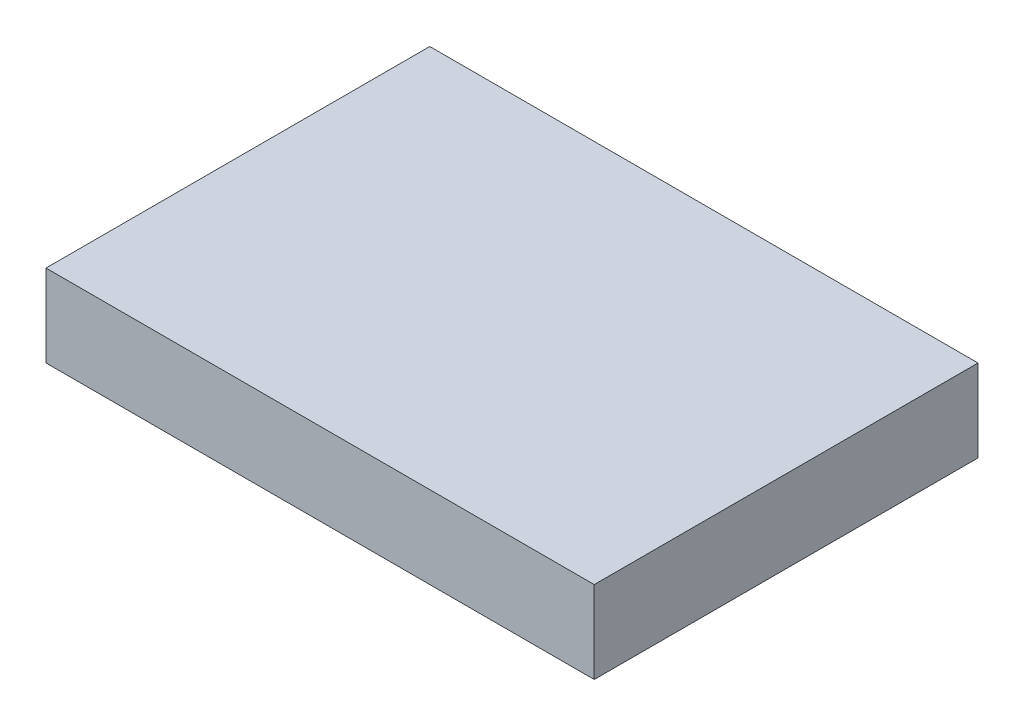
ISO-10303-21;
HEADER;
FILE_DESCRIPTION(('STEP AP214'),'2;1');
FILE_NAME('part.step','',(''),(''),'','','');
FILE_SCHEMA(('AUTOMOTIVE_DESIGN { 1 0 10303 214 1 1 1 1 }'));
ENDSEC;
DATA;
#1=APPLICATION_CONTEXT('core data for automotive mechanical design processes');
#2=APPLICATION_PROTOCOL_DEFINITION('international standard','automotive_design',2000,#1);
#3=PRODUCT_CONTEXT('',#1,'mechanical');
#4=PRODUCT('Part','Part','',(#3));
#5=PRODUCT_RELATED_PRODUCT_CATEGORY('part','',(#4));
#6=PRODUCT_DEFINITION_FORMATION('','',#4);
#7=PRODUCT_DEFINITION_CONTEXT('part definition',#1,'design');
#8=PRODUCT_DEFINITION('design','',#6,#7);
#9=PRODUCT_DEFINITION_SHAPE('','',#8);
#10=(LENGTH_UNIT() NAMED_UNIT(*) SI_UNIT(.MILLI.,.METRE.));
#11=(NAMED_UNIT(*) PLANE_ANGLE_UNIT() SI_UNIT($,.RADIAN.));
#12=(NAMED_UNIT(*) SI_UNIT($,.STERADIAN.) SOLID_ANGLE_UNIT());
#13=UNCERTAINTY_MEASURE_WITH_UNIT(LENGTH_MEASURE(1.E-05),#10,'distance_accuracy_value','');
#14=(GEOMETRIC_REPRESENTATION_CONTEXT(3) GLOBAL_UNCERTAINTY_ASSIGNED_CONTEXT((#13)) GLOBAL_UNIT_ASSIGNED_CONTEXT((#10,
#11,#12)) REPRESENTATION_CONTEXT('',''));
#15=CARTESIAN_POINT('',(0.,0.,0.));
#16=DIRECTION('',(0.,0.,1.));
#17=DIRECTION('',(1.,0.,0.));
#18=AXIS2_PLACEMENT_3D('',#15,#16,#17);
#19=CARTESIAN_POINT('',(50.,15.,35.));
#20=DIRECTION('',(-1.,0.,0.));
#21=DIRECTION('',(0.,0.,1.));
#22=AXIS2_PLACEMENT_3D('',#19,#20,#21);
#23=PLANE('',#22);
#24=DIRECTION('',(0.,0.,-1.));
#25=VECTOR('',#24,1.);
#26=CARTESIAN_POINT('',(50.,0.,35.));
#27=LINE('',#26,#25);
#28=CARTESIAN_POINT('',(50.,0.,35.));
#29=VERTEX_POINT('',#28);
#30=CARTESIAN_POINT('',(50.,0.,-35.));
#31=VERTEX_POINT('',#30);
#32=EDGE_CURVE('E94',#29,#31,#27,.T.);
#33=ORIENTED_EDGE('',*,*,#32,.T.);
#34=DIRECTION('',(0.,-1.,0.));
#35=VECTOR('',#34,1.);
#36=CARTESIAN_POINT('',(50.,15.,-35.));
#37=LINE('',#36,#35);
#38=CARTESIAN_POINT('',(50.,15.,-35.));
#39=VERTEX_POINT('',#38);
#40=EDGE_CURVE('E11',#39,#31,#37,.T.);
#41=ORIENTED_EDGE('',*,*,#40,.F.);
#42=DIRECTION('',(0.,0.,-1.));
#43=VECTOR('',#42,1.);
#44=CARTESIAN_POINT('',(50.,15.,35.));
#45=LINE('',#44,#43);
#46=CARTESIAN_POINT('',(50.,15.,35.));
#47=VERTEX_POINT('',#46);
#48=EDGE_CURVE('E82',#47,#39,#45,.T.);
#49=ORIENTED_EDGE('',*,*,#48,.F.);
#50=DIRECTION('',(0.,-1.,0.));
#51=VECTOR('',#50,1.);
#52=CARTESIAN_POINT('',(50.,15.,35.));
#53=LINE('',#52,#51);
#54=EDGE_CURVE('E90',#47,#29,#53,.T.);
#55=ORIENTED_EDGE('',*,*,#54,.T.);
#56=EDGE_LOOP('',(#33,#41,#49,#55));
#57=FACE_BOUND('',#56,.T.);
#58=ADVANCED_FACE('F31',(#57),#23,.F.);
#59=CARTESIAN_POINT('',(-50.,15.,-35.));
#60=DIRECTION('',(0.,0.,1.));
#61=DIRECTION('',(1.,0.,0.));
#62=AXIS2_PLACEMENT_3D('',#59,#60,#61);
#63=PLANE('',#62);
#64=DIRECTION('',(-1.,0.,0.));
#65=VECTOR('',#64,1.);
#66=CARTESIAN_POINT('',(-50.,0.,-35.));
#67=LINE('',#66,#65);
#68=CARTESIAN_POINT('',(-50.,0.,-35.));
#69=VERTEX_POINT('',#68);
#70=EDGE_CURVE('E86',#31,#69,#67,.T.);
#71=ORIENTED_EDGE('',*,*,#70,.T.);
#72=DIRECTION('',(0.,-1.,0.));
#73=VECTOR('',#72,1.);
#74=CARTESIAN_POINT('',(-50.,15.,-35.));
#75=LINE('',#74,#73);
#76=CARTESIAN_POINT('',(-50.,15.,-35.));
#77=VERTEX_POINT('',#76);
#78=EDGE_CURVE('E39',#77,#69,#75,.T.);
#79=ORIENTED_EDGE('',*,*,#78,.F.);
#80=DIRECTION('',(-1.,0.,0.));
#81=VECTOR('',#80,1.);
#82=CARTESIAN_POINT('',(-50.,15.,-35.));
#83=LINE('',#82,#81);
#84=EDGE_CURVE('E77',#39,#77,#83,.T.);
#85=ORIENTED_EDGE('',*,*,#84,.F.);
#86=ORIENTED_EDGE('',*,*,#40,.T.);
#87=EDGE_LOOP('',(#71,#79,#85,#86));
#88=FACE_BOUND('',#87,.T.);
#89=ADVANCED_FACE('F85',(#88),#63,.F.);
#90=CARTESIAN_POINT('',(-50.,15.,35.));
#91=DIRECTION('',(1.,0.,0.));
#92=DIRECTION('',(0.,0.,-1.));
#93=AXIS2_PLACEMENT_3D('',#90,#91,#92);
#94=PLANE('',#93);
#95=DIRECTION('',(0.,0.,1.));
#96=VECTOR('',#95,1.);
#97=CARTESIAN_POINT('',(-50.,0.,35.));
#98=LINE('',#97,#96);
#99=CARTESIAN_POINT('',(-50.,0.,35.));
#100=VERTEX_POINT('',#99);
#101=EDGE_CURVE('E64',#69,#100,#98,.T.);
#102=ORIENTED_EDGE('',*,*,#101,.T.);
#103=DIRECTION('',(0.,-1.,0.));
#104=VECTOR('',#103,1.);
#105=CARTESIAN_POINT('',(-50.,15.,35.));
#106=LINE('',#105,#104);
#107=CARTESIAN_POINT('',(-50.,15.,35.));
#108=VERTEX_POINT('',#107);
#109=EDGE_CURVE('E87',#108,#100,#106,.T.);
#110=ORIENTED_EDGE('',*,*,#109,.F.);
#111=DIRECTION('',(0.,0.,1.));
#112=VECTOR('',#111,1.);
#113=CARTESIAN_POINT('',(-50.,15.,35.));
#114=LINE('',#113,#112);
#115=EDGE_CURVE('E80',#77,#108,#114,.T.);
#116=ORIENTED_EDGE('',*,*,#115,.F.);
#117=ORIENTED_EDGE('',*,*,#78,.T.);
#118=EDGE_LOOP('',(#102,#110,#116,#117));
#119=FACE_BOUND('',#118,.T.);
#120=ADVANCED_FACE('F88',(#119),#94,.F.);
#121=CARTESIAN_POINT('',(-50.,15.,35.));
#122=DIRECTION('',(0.,0.,-1.));
#123=DIRECTION('',(-1.,0.,0.));
#124=AXIS2_PLACEMENT_3D('',#121,#122,#123);
#125=PLANE('',#124);
#126=DIRECTION('',(1.,0.,0.));
#127=VECTOR('',#126,1.);
#128=CARTESIAN_POINT('',(-50.,0.,35.));
#129=LINE('',#128,#127);
#130=EDGE_CURVE('E70',#100,#29,#129,.T.);
#131=ORIENTED_EDGE('',*,*,#130,.T.);
#132=ORIENTED_EDGE('',*,*,#54,.F.);
#133=DIRECTION('',(1.,0.,0.));
#134=VECTOR('',#133,1.);
#135=CARTESIAN_POINT('',(-50.,15.,35.));
#136=LINE('',#135,#134);
#137=EDGE_CURVE('E47',#108,#47,#136,.T.);
#138=ORIENTED_EDGE('',*,*,#137,.F.);
#139=ORIENTED_EDGE('',*,*,#109,.T.);
#140=EDGE_LOOP('',(#131,#132,#138,#139));
#141=FACE_BOUND('',#140,.T.);
#142=ADVANCED_FACE('F101',(#141),#125,.F.);
#143=CARTESIAN_POINT('',(50.,15.,-35.));
#144=DIRECTION('',(0.,-1.,0.));
#145=DIRECTION('',(0.,0.,-1.));
#146=AXIS2_PLACEMENT_3D('',#143,#144,#145);
#147=PLANE('',#146);
#148=ORIENTED_EDGE('',*,*,#48,.T.);
#149=ORIENTED_EDGE('',*,*,#84,.T.);
#150=ORIENTED_EDGE('',*,*,#115,.T.);
#151=ORIENTED_EDGE('',*,*,#137,.T.);
#152=EDGE_LOOP('',(#148,#149,#150,#151));
#153=FACE_BOUND('',#152,.T.);
#154=ADVANCED_FACE('F78',(#153),#147,.F.);
#155=CARTESIAN_POINT('',(50.,0.,-35.));
#156=DIRECTION('',(0.,-1.,0.));
#157=DIRECTION('',(0.,0.,-1.));
#158=AXIS2_PLACEMENT_3D('',#155,#156,#157);
#159=PLANE('',#158);
#160=ORIENTED_EDGE('',*,*,#32,.F.);
#161=ORIENTED_EDGE('',*,*,#130,.F.);
#162=ORIENTED_EDGE('',*,*,#101,.F.);
#163=ORIENTED_EDGE('',*,*,#70,.F.);
#164=EDGE_LOOP('',(#160,#161,#162,#163));
#165=FACE_BOUND('',#164,.T.);
#166=ADVANCED_FACE('F104',(#165),#159,.T.);
#167=CLOSED_SHELL('',(#58,#89,#120,#142,#154,#166));
#168=MANIFOLD_SOLID_BREP('B2',#167);
#169=ADVANCED_BREP_SHAPE_REPRESENTATION('',(#18,#168),#14);
#170=SHAPE_DEFINITION_REPRESENTATION(#9,#169);
ENDSEC;
END-ISO-10303-21;
